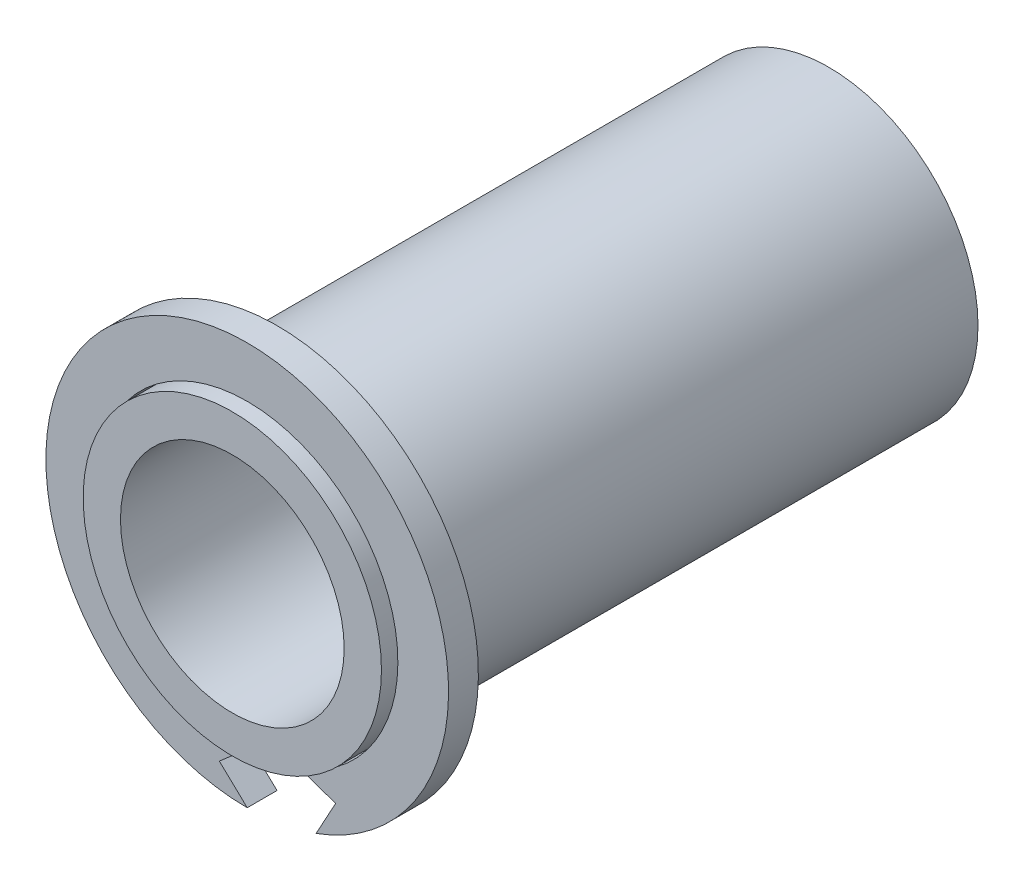
ISO-10303-21;
HEADER;
FILE_DESCRIPTION(('STEP AP214'),'2;1');
FILE_NAME('part.step','',(''),(''),'','','');
FILE_SCHEMA(('AUTOMOTIVE_DESIGN { 1 0 10303 214 1 1 1 1 }'));
ENDSEC;
DATA;
#1=APPLICATION_CONTEXT('core data for automotive mechanical design processes');
#2=APPLICATION_PROTOCOL_DEFINITION('international standard','automotive_design',2000,#1);
#3=PRODUCT_CONTEXT('',#1,'mechanical');
#4=PRODUCT('Part','Part','',(#3));
#5=PRODUCT_RELATED_PRODUCT_CATEGORY('part','',(#4));
#6=PRODUCT_DEFINITION_FORMATION('','',#4);
#7=PRODUCT_DEFINITION_CONTEXT('part definition',#1,'design');
#8=PRODUCT_DEFINITION('design','',#6,#7);
#9=PRODUCT_DEFINITION_SHAPE('','',#8);
#10=(LENGTH_UNIT() NAMED_UNIT(*) SI_UNIT(.MILLI.,.METRE.));
#11=(NAMED_UNIT(*) PLANE_ANGLE_UNIT() SI_UNIT($,.RADIAN.));
#12=(NAMED_UNIT(*) SI_UNIT($,.STERADIAN.) SOLID_ANGLE_UNIT());
#13=UNCERTAINTY_MEASURE_WITH_UNIT(LENGTH_MEASURE(1.E-05),#10,'distance_accuracy_value','');
#14=(GEOMETRIC_REPRESENTATION_CONTEXT(3) GLOBAL_UNCERTAINTY_ASSIGNED_CONTEXT((#13)) GLOBAL_UNIT_ASSIGNED_CONTEXT((#10,
#11,#12)) REPRESENTATION_CONTEXT('',''));
#15=CARTESIAN_POINT('',(0.,0.,0.));
#16=DIRECTION('',(0.,0.,1.));
#17=DIRECTION('',(1.,0.,0.));
#18=AXIS2_PLACEMENT_3D('',#15,#16,#17);
#19=CARTESIAN_POINT('',(-2.69627194994127,-2.84183642677352,14.8));
#20=DIRECTION('',(-0.688283368273519,-0.725441937689061,0.));
#21=DIRECTION('',(0.725441937689061,-0.688283368273519,0.));
#22=AXIS2_PLACEMENT_3D('',#19,#20,#21);
#23=PLANE('',#22);
#24=DIRECTION('',(0.725441937689061,-0.688283368273519,0.));
#25=VECTOR('',#24,1.);
#26=CARTESIAN_POINT('',(-2.69627194994127,-2.84183642677352,15.6));
#27=LINE('',#26,#25);
#28=CARTESIAN_POINT('',(-0.747466556801848,-4.69082015712208,15.6));
#29=VERTEX_POINT('',#28);
#30=CARTESIAN_POINT('',(0.,-5.4,15.6));
#31=VERTEX_POINT('',#30);
#32=EDGE_CURVE('E129',#29,#31,#27,.T.);
#33=ORIENTED_EDGE('',*,*,#32,.T.);
#34=DIRECTION('',(0.,0.,1.));
#35=VECTOR('',#34,1.);
#36=CARTESIAN_POINT('',(0.,-5.4,14.8));
#37=LINE('',#36,#35);
#38=CARTESIAN_POINT('',(0.,-5.4,14.8));
#39=VERTEX_POINT('',#38);
#40=EDGE_CURVE('E12',#39,#31,#37,.T.);
#41=ORIENTED_EDGE('',*,*,#40,.F.);
#42=DIRECTION('',(0.725441937689061,-0.688283368273519,0.));
#43=VECTOR('',#42,1.);
#44=CARTESIAN_POINT('',(-2.69627194994127,-2.84183642677352,14.8));
#45=LINE('',#44,#43);
#46=CARTESIAN_POINT('',(-0.747466556801848,-4.69082015712208,14.8));
#47=VERTEX_POINT('',#46);
#48=EDGE_CURVE('E65',#47,#39,#45,.T.);
#49=ORIENTED_EDGE('',*,*,#48,.F.);
#50=DIRECTION('',(0.,0.,1.));
#51=VECTOR('',#50,1.);
#52=CARTESIAN_POINT('',(-0.747466556801848,-4.69082015712208,14.8));
#53=LINE('',#52,#51);
#54=EDGE_CURVE('E50',#47,#29,#53,.T.);
#55=ORIENTED_EDGE('',*,*,#54,.T.);
#56=EDGE_LOOP('',(#33,#41,#49,#55));
#57=FACE_BOUND('',#56,.T.);
#58=ADVANCED_FACE('F47',(#57),#23,.F.);
#59=CARTESIAN_POINT('',(0.,0.,14.8));
#60=DIRECTION('',(0.,0.,1.));
#61=DIRECTION('',(1.,0.,0.));
#62=AXIS2_PLACEMENT_3D('',#59,#60,#61);
#63=CYLINDRICAL_SURFACE('',#62,5.4);
#64=CARTESIAN_POINT('',(0.,0.,15.6));
#65=DIRECTION('',(0.,0.,1.));
#66=DIRECTION('',(1.,0.,0.));
#67=AXIS2_PLACEMENT_3D('',#64,#65,#66);
#68=CIRCLE('',#67,5.4);
#69=CARTESIAN_POINT('',(1.84690877395861,-5.0743401522439,15.6));
#70=VERTEX_POINT('',#69);
#71=EDGE_CURVE('E138',#70,#31,#68,.T.);
#72=ORIENTED_EDGE('',*,*,#71,.F.);
#73=DIRECTION('',(0.,0.,1.));
#74=VECTOR('',#73,1.);
#75=CARTESIAN_POINT('',(1.84690877395861,-5.0743401522439,14.8));
#76=LINE('',#75,#74);
#77=CARTESIAN_POINT('',(1.84690877395861,-5.0743401522439,14.8));
#78=VERTEX_POINT('',#77);
#79=EDGE_CURVE('E56',#78,#70,#76,.T.);
#80=ORIENTED_EDGE('',*,*,#79,.F.);
#81=CARTESIAN_POINT('',(0.,0.,14.8));
#82=DIRECTION('',(0.,0.,1.));
#83=DIRECTION('',(1.,0.,0.));
#84=AXIS2_PLACEMENT_3D('',#81,#82,#83);
#85=CIRCLE('',#84,5.4);
#86=EDGE_CURVE('E119',#78,#39,#85,.T.);
#87=ORIENTED_EDGE('',*,*,#86,.T.);
#88=ORIENTED_EDGE('',*,*,#40,.T.);
#89=EDGE_LOOP('',(#72,#80,#87,#88));
#90=FACE_BOUND('',#89,.T.);
#91=ADVANCED_FACE('F153',(#90),#63,.T.);
#92=CARTESIAN_POINT('',(3.55703494415724,-1.94197813325448,14.8));
#93=DIRECTION('',(-0.877711151791712,0.479190081304347,0.));
#94=DIRECTION('',(-0.479190081304347,-0.877711151791712,0.));
#95=AXIS2_PLACEMENT_3D('',#92,#93,#94);
#96=PLANE('',#95);
#97=DIRECTION('',(-0.479190081304347,-0.877711151791712,0.));
#98=VECTOR('',#97,1.);
#99=CARTESIAN_POINT('',(3.55703494415724,-1.94197813325448,15.6));
#100=LINE('',#99,#98);
#101=CARTESIAN_POINT('',(2.36977217151666,-4.11663453018424,15.6));
#102=VERTEX_POINT('',#101);
#103=EDGE_CURVE('E109',#102,#70,#100,.T.);
#104=ORIENTED_EDGE('',*,*,#103,.F.);
#105=DIRECTION('',(0.,0.,1.));
#106=VECTOR('',#105,1.);
#107=CARTESIAN_POINT('',(2.36977217151666,-4.11663453018424,14.8));
#108=LINE('',#107,#106);
#109=CARTESIAN_POINT('',(2.36977217151666,-4.11663453018424,14.8));
#110=VERTEX_POINT('',#109);
#111=EDGE_CURVE('E105',#110,#102,#108,.T.);
#112=ORIENTED_EDGE('',*,*,#111,.F.);
#113=DIRECTION('',(-0.479190081304347,-0.877711151791712,0.));
#114=VECTOR('',#113,1.);
#115=CARTESIAN_POINT('',(3.55703494415724,-1.94197813325448,14.8));
#116=LINE('',#115,#114);
#117=EDGE_CURVE('E108',#110,#78,#116,.T.);
#118=ORIENTED_EDGE('',*,*,#117,.T.);
#119=ORIENTED_EDGE('',*,*,#79,.T.);
#120=EDGE_LOOP('',(#104,#112,#118,#119));
#121=FACE_BOUND('',#120,.T.);
#122=ADVANCED_FACE('F107',(#121),#96,.T.);
#123=CARTESIAN_POINT('',(-1.03601208201324,-2.89988504512465,14.8));
#124=DIRECTION('',(-0.336433985883418,-0.941707052720004,0.));
#125=DIRECTION('',(0.941707052720004,-0.336433985883418,0.));
#126=AXIS2_PLACEMENT_3D('',#123,#124,#125);
#127=PLANE('',#126);
#128=DIRECTION('',(0.941707052720004,-0.336433985883418,0.));
#129=VECTOR('',#128,1.);
#130=CARTESIAN_POINT('',(-1.03601208201324,-2.89988504512465,15.6));
#131=LINE('',#130,#129);
#132=CARTESIAN_POINT('',(1.42743779868389,-3.77997642810104,15.6));
#133=VERTEX_POINT('',#132);
#134=EDGE_CURVE('E135',#133,#102,#131,.T.);
#135=ORIENTED_EDGE('',*,*,#134,.F.);
#136=DIRECTION('',(0.,0.,1.));
#137=VECTOR('',#136,1.);
#138=CARTESIAN_POINT('',(1.42743779868389,-3.77997642810104,14.8));
#139=LINE('',#138,#137);
#140=CARTESIAN_POINT('',(1.42743779868389,-3.77997642810104,14.8));
#141=VERTEX_POINT('',#140);
#142=EDGE_CURVE('E114',#141,#133,#139,.T.);
#143=ORIENTED_EDGE('',*,*,#142,.F.);
#144=DIRECTION('',(0.941707052720004,-0.336433985883418,0.));
#145=VECTOR('',#144,1.);
#146=CARTESIAN_POINT('',(-1.03601208201324,-2.89988504512465,14.8));
#147=LINE('',#146,#145);
#148=EDGE_CURVE('E118',#141,#110,#147,.T.);
#149=ORIENTED_EDGE('',*,*,#148,.T.);
#150=ORIENTED_EDGE('',*,*,#111,.T.);
#151=EDGE_LOOP('',(#135,#143,#149,#150));
#152=FACE_BOUND('',#151,.T.);
#153=ADVANCED_FACE('F121',(#152),#127,.T.);
#154=CARTESIAN_POINT('',(0.,0.,14.8));
#155=DIRECTION('',(0.,0.,1.));
#156=DIRECTION('',(1.,0.,0.));
#157=AXIS2_PLACEMENT_3D('',#154,#155,#156);
#158=CYLINDRICAL_SURFACE('',#157,4.04051982622422);
#159=CARTESIAN_POINT('',(0.,0.,15.6));
#160=DIRECTION('',(0.,0.,1.));
#161=DIRECTION('',(1.,0.,0.));
#162=AXIS2_PLACEMENT_3D('',#159,#160,#161);
#163=CIRCLE('',#162,4.04051982622422);
#164=CARTESIAN_POINT('',(0.,-4.04051982622422,15.6));
#165=VERTEX_POINT('',#164);
#166=EDGE_CURVE('E133',#133,#165,#163,.T.);
#167=ORIENTED_EDGE('',*,*,#166,.T.);
#168=DIRECTION('',(0.,0.,1.));
#169=VECTOR('',#168,1.);
#170=CARTESIAN_POINT('',(0.,-4.04051982622422,14.8));
#171=LINE('',#170,#169);
#172=CARTESIAN_POINT('',(0.,-4.04051982622422,14.8));
#173=VERTEX_POINT('',#172);
#174=EDGE_CURVE('E142',#173,#165,#171,.T.);
#175=ORIENTED_EDGE('',*,*,#174,.F.);
#176=CARTESIAN_POINT('',(0.,0.,14.8));
#177=DIRECTION('',(0.,0.,1.));
#178=DIRECTION('',(1.,0.,0.));
#179=AXIS2_PLACEMENT_3D('',#176,#177,#178);
#180=CIRCLE('',#179,4.04051982622422);
#181=EDGE_CURVE('E123',#141,#173,#180,.T.);
#182=ORIENTED_EDGE('',*,*,#181,.F.);
#183=ORIENTED_EDGE('',*,*,#142,.T.);
#184=EDGE_LOOP('',(#167,#175,#182,#183));
#185=FACE_BOUND('',#184,.T.);
#186=ADVANCED_FACE('F166',(#185),#158,.F.);
#187=CARTESIAN_POINT('',(2.00082848175418,-2.29978719823651,14.8));
#188=DIRECTION('',(-0.656368021350491,0.75444086617073,0.));
#189=DIRECTION('',(-0.75444086617073,-0.656368021350491,0.));
#190=AXIS2_PLACEMENT_3D('',#187,#188,#189);
#191=PLANE('',#190);
#192=DIRECTION('',(-0.75444086617073,-0.656368021350491,0.));
#193=VECTOR('',#192,1.);
#194=CARTESIAN_POINT('',(2.00082848175418,-2.29978719823651,15.6));
#195=LINE('',#194,#193);
#196=EDGE_CURVE('E131',#165,#29,#195,.T.);
#197=ORIENTED_EDGE('',*,*,#196,.T.);
#198=ORIENTED_EDGE('',*,*,#54,.F.);
#199=DIRECTION('',(-0.75444086617073,-0.656368021350491,0.));
#200=VECTOR('',#199,1.);
#201=CARTESIAN_POINT('',(2.00082848175418,-2.29978719823651,14.8));
#202=LINE('',#201,#200);
#203=EDGE_CURVE('E98',#173,#47,#202,.T.);
#204=ORIENTED_EDGE('',*,*,#203,.F.);
#205=ORIENTED_EDGE('',*,*,#174,.T.);
#206=EDGE_LOOP('',(#197,#198,#204,#205));
#207=FACE_BOUND('',#206,.T.);
#208=ADVANCED_FACE('F168',(#207),#191,.F.);
#209=CARTESIAN_POINT('',(0.,0.,14.8));
#210=DIRECTION('',(0.,0.,1.));
#211=DIRECTION('',(1.,0.,0.));
#212=AXIS2_PLACEMENT_3D('',#209,#210,#211);
#213=PLANE('',#212);
#214=ORIENTED_EDGE('',*,*,#48,.T.);
#215=ORIENTED_EDGE('',*,*,#86,.F.);
#216=ORIENTED_EDGE('',*,*,#117,.F.);
#217=ORIENTED_EDGE('',*,*,#148,.F.);
#218=ORIENTED_EDGE('',*,*,#181,.T.);
#219=ORIENTED_EDGE('',*,*,#203,.T.);
#220=EDGE_LOOP('',(#214,#215,#216,#217,#218,#219));
#221=FACE_BOUND('',#220,.T.);
#222=ADVANCED_FACE('F117',(#221),#213,.F.);
#223=CARTESIAN_POINT('',(0.,0.,15.6));
#224=DIRECTION('',(0.,0.,1.));
#225=DIRECTION('',(1.,0.,0.));
#226=AXIS2_PLACEMENT_3D('',#223,#224,#225);
#227=PLANE('',#226);
#228=ORIENTED_EDGE('',*,*,#32,.F.);
#229=ORIENTED_EDGE('',*,*,#196,.F.);
#230=ORIENTED_EDGE('',*,*,#166,.F.);
#231=ORIENTED_EDGE('',*,*,#134,.T.);
#232=ORIENTED_EDGE('',*,*,#103,.T.);
#233=ORIENTED_EDGE('',*,*,#71,.T.);
#234=EDGE_LOOP('',(#228,#229,#230,#231,#232,#233));
#235=FACE_BOUND('',#234,.T.);
#236=ADVANCED_FACE('F151',(#235),#227,.T.);
#237=CLOSED_SHELL('',(#58,#91,#122,#153,#186,#208,#222,#236));
#238=MANIFOLD_SOLID_BREP('B2',#237);
#239=CARTESIAN_POINT('',(0.,0.,16.));
#240=DIRECTION('',(0.,0.,1.));
#241=DIRECTION('',(1.,0.,0.));
#242=AXIS2_PLACEMENT_3D('',#239,#240,#241);
#243=PLANE('',#242);
#244=CARTESIAN_POINT('',(0.,0.,16.));
#245=DIRECTION('',(0.,0.,1.));
#246=DIRECTION('',(1.,0.,0.));
#247=AXIS2_PLACEMENT_3D('',#244,#245,#246);
#248=CIRCLE('',#247,4.);
#249=CARTESIAN_POINT('',(4.,0.,16.));
#250=VERTEX_POINT('',#249);
#251=EDGE_CURVE('E46',#250,#250,#248,.T.);
#252=ORIENTED_EDGE('',*,*,#251,.T.);
#253=EDGE_LOOP('',(#252));
#254=FACE_BOUND('',#253,.T.);
#255=CARTESIAN_POINT('',(0.,0.,16.));
#256=DIRECTION('',(0.,0.,1.));
#257=DIRECTION('',(1.,0.,0.));
#258=AXIS2_PLACEMENT_3D('',#255,#256,#257);
#259=CIRCLE('',#258,3.);
#260=CARTESIAN_POINT('',(3.,0.,16.));
#261=VERTEX_POINT('',#260);
#262=EDGE_CURVE('E242',#261,#261,#259,.T.);
#263=ORIENTED_EDGE('',*,*,#262,.F.);
#264=EDGE_LOOP('',(#263));
#265=FACE_BOUND('',#264,.T.);
#266=ADVANCED_FACE('F229',(#254,#265),#243,.T.);
#267=CARTESIAN_POINT('',(0.,0.,0.));
#268=DIRECTION('',(0.,0.,1.));
#269=DIRECTION('',(1.,0.,0.));
#270=AXIS2_PLACEMENT_3D('',#267,#268,#269);
#271=PLANE('',#270);
#272=CARTESIAN_POINT('',(0.,0.,0.));
#273=DIRECTION('',(0.,0.,1.));
#274=DIRECTION('',(1.,0.,0.));
#275=AXIS2_PLACEMENT_3D('',#272,#273,#274);
#276=CIRCLE('',#275,4.);
#277=CARTESIAN_POINT('',(4.,0.,0.));
#278=VERTEX_POINT('',#277);
#279=EDGE_CURVE('E233',#278,#278,#276,.T.);
#280=ORIENTED_EDGE('',*,*,#279,.F.);
#281=EDGE_LOOP('',(#280));
#282=FACE_BOUND('',#281,.T.);
#283=CARTESIAN_POINT('',(0.,0.,0.));
#284=DIRECTION('',(0.,0.,1.));
#285=DIRECTION('',(1.,0.,0.));
#286=AXIS2_PLACEMENT_3D('',#283,#284,#285);
#287=CIRCLE('',#286,3.);
#288=CARTESIAN_POINT('',(3.,0.,0.));
#289=VERTEX_POINT('',#288);
#290=EDGE_CURVE('E244',#289,#289,#287,.T.);
#291=ORIENTED_EDGE('',*,*,#290,.T.);
#292=EDGE_LOOP('',(#291));
#293=FACE_BOUND('',#292,.T.);
#294=ADVANCED_FACE('F256',(#282,#293),#271,.F.);
#295=CARTESIAN_POINT('',(0.,0.,16.));
#296=DIRECTION('',(0.,0.,-1.));
#297=DIRECTION('',(-1.,0.,0.));
#298=AXIS2_PLACEMENT_3D('',#295,#296,#297);
#299=CYLINDRICAL_SURFACE('',#298,4.);
#300=ORIENTED_EDGE('',*,*,#251,.F.);
#301=EDGE_LOOP('',(#300));
#302=FACE_BOUND('',#301,.T.);
#303=ORIENTED_EDGE('',*,*,#279,.T.);
#304=EDGE_LOOP('',(#303));
#305=FACE_BOUND('',#304,.T.);
#306=ADVANCED_FACE('F231',(#302,#305),#299,.T.);
#307=CARTESIAN_POINT('',(0.,0.,16.));
#308=DIRECTION('',(0.,0.,-1.));
#309=DIRECTION('',(-1.,0.,0.));
#310=AXIS2_PLACEMENT_3D('',#307,#308,#309);
#311=CYLINDRICAL_SURFACE('',#310,3.);
#312=ORIENTED_EDGE('',*,*,#262,.T.);
#313=EDGE_LOOP('',(#312));
#314=FACE_BOUND('',#313,.T.);
#315=ORIENTED_EDGE('',*,*,#290,.F.);
#316=EDGE_LOOP('',(#315));
#317=FACE_BOUND('',#316,.T.);
#318=ADVANCED_FACE('F252',(#314,#317),#311,.F.);
#319=CLOSED_SHELL('',(#266,#294,#306,#318));
#320=MANIFOLD_SOLID_BREP('B6',#319);
#321=ADVANCED_BREP_SHAPE_REPRESENTATION('',(#18,#238,#320),#14);
#322=SHAPE_DEFINITION_REPRESENTATION(#9,#321);
ENDSEC;
END-ISO-10303-21;
